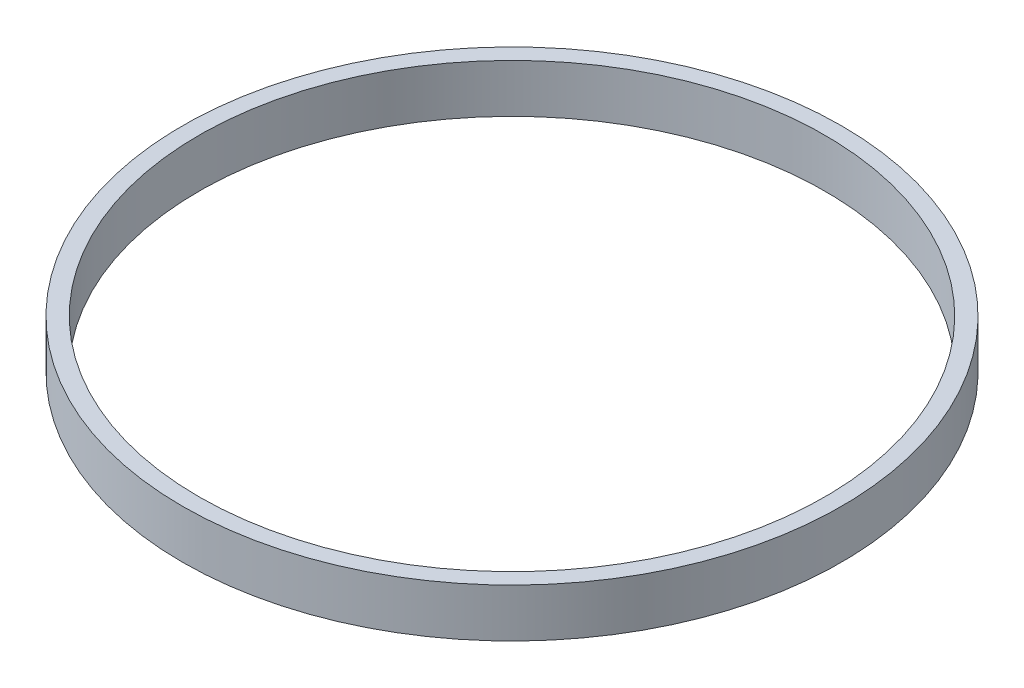
ISO-10303-21;
HEADER;
FILE_DESCRIPTION(('STEP AP214'),'2;1');
FILE_NAME('part.step','',(''),(''),'','','');
FILE_SCHEMA(('AUTOMOTIVE_DESIGN { 1 0 10303 214 1 1 1 1 }'));
ENDSEC;
DATA;
#1=APPLICATION_CONTEXT('core data for automotive mechanical design processes');
#2=APPLICATION_PROTOCOL_DEFINITION('international standard','automotive_design',2000,#1);
#3=PRODUCT_CONTEXT('',#1,'mechanical');
#4=PRODUCT('Part','Part','',(#3));
#5=PRODUCT_RELATED_PRODUCT_CATEGORY('part','',(#4));
#6=PRODUCT_DEFINITION_FORMATION('','',#4);
#7=PRODUCT_DEFINITION_CONTEXT('part definition',#1,'design');
#8=PRODUCT_DEFINITION('design','',#6,#7);
#9=PRODUCT_DEFINITION_SHAPE('','',#8);
#10=(LENGTH_UNIT() NAMED_UNIT(*) SI_UNIT(.MILLI.,.METRE.));
#11=(NAMED_UNIT(*) PLANE_ANGLE_UNIT() SI_UNIT($,.RADIAN.));
#12=(NAMED_UNIT(*) SI_UNIT($,.STERADIAN.) SOLID_ANGLE_UNIT());
#13=UNCERTAINTY_MEASURE_WITH_UNIT(LENGTH_MEASURE(1.E-05),#10,'distance_accuracy_value','');
#14=(GEOMETRIC_REPRESENTATION_CONTEXT(3) GLOBAL_UNCERTAINTY_ASSIGNED_CONTEXT((#13)) GLOBAL_UNIT_ASSIGNED_CONTEXT((#10,
#11,#12)) REPRESENTATION_CONTEXT('',''));
#15=CARTESIAN_POINT('',(0.,0.,0.));
#16=DIRECTION('',(0.,0.,1.));
#17=DIRECTION('',(1.,0.,0.));
#18=AXIS2_PLACEMENT_3D('',#15,#16,#17);
#19=CARTESIAN_POINT('',(0.,2.5,0.));
#20=DIRECTION('',(0.,-1.,0.));
#21=DIRECTION('',(0.,0.,-1.));
#22=AXIS2_PLACEMENT_3D('',#19,#20,#21);
#23=CYLINDRICAL_SURFACE('',#22,16.15);
#24=CARTESIAN_POINT('',(0.,2.5,0.));
#25=DIRECTION('',(0.,1.,0.));
#26=DIRECTION('',(0.,0.,1.));
#27=AXIS2_PLACEMENT_3D('',#24,#25,#26);
#28=CIRCLE('',#27,16.15);
#29=CARTESIAN_POINT('',(0.,2.5,16.15));
#30=VERTEX_POINT('',#29);
#31=EDGE_CURVE('E48',#30,#30,#28,.T.);
#32=ORIENTED_EDGE('',*,*,#31,.T.);
#33=EDGE_LOOP('',(#32));
#34=FACE_BOUND('',#33,.T.);
#35=CARTESIAN_POINT('',(0.,0.,0.));
#36=DIRECTION('',(0.,1.,0.));
#37=DIRECTION('',(0.,0.,1.));
#38=AXIS2_PLACEMENT_3D('',#35,#36,#37);
#39=CIRCLE('',#38,16.15);
#40=CARTESIAN_POINT('',(0.,0.,16.15));
#41=VERTEX_POINT('',#40);
#42=EDGE_CURVE('E54',#41,#41,#39,.T.);
#43=ORIENTED_EDGE('',*,*,#42,.F.);
#44=EDGE_LOOP('',(#43));
#45=FACE_BOUND('',#44,.T.);
#46=ADVANCED_FACE('F41',(#34,#45),#23,.F.);
#47=CARTESIAN_POINT('',(0.,2.5,0.));
#48=DIRECTION('',(0.,-1.,0.));
#49=DIRECTION('',(0.,0.,-1.));
#50=AXIS2_PLACEMENT_3D('',#47,#48,#49);
#51=CYLINDRICAL_SURFACE('',#50,17.);
#52=CARTESIAN_POINT('',(0.,2.5,0.));
#53=DIRECTION('',(0.,1.,0.));
#54=DIRECTION('',(0.,0.,1.));
#55=AXIS2_PLACEMENT_3D('',#52,#53,#54);
#56=CIRCLE('',#55,17.);
#57=CARTESIAN_POINT('',(0.,2.5,17.));
#58=VERTEX_POINT('',#57);
#59=EDGE_CURVE('E10',#58,#58,#56,.T.);
#60=ORIENTED_EDGE('',*,*,#59,.F.);
#61=EDGE_LOOP('',(#60));
#62=FACE_BOUND('',#61,.T.);
#63=CARTESIAN_POINT('',(0.,0.,0.));
#64=DIRECTION('',(0.,1.,0.));
#65=DIRECTION('',(0.,0.,1.));
#66=AXIS2_PLACEMENT_3D('',#63,#64,#65);
#67=CIRCLE('',#66,17.);
#68=CARTESIAN_POINT('',(0.,0.,17.));
#69=VERTEX_POINT('',#68);
#70=EDGE_CURVE('E44',#69,#69,#67,.T.);
#71=ORIENTED_EDGE('',*,*,#70,.T.);
#72=EDGE_LOOP('',(#71));
#73=FACE_BOUND('',#72,.T.);
#74=ADVANCED_FACE('F61',(#62,#73),#51,.T.);
#75=CARTESIAN_POINT('',(0.,2.5,0.));
#76=DIRECTION('',(0.,1.,0.));
#77=DIRECTION('',(0.,0.,1.));
#78=AXIS2_PLACEMENT_3D('',#75,#76,#77);
#79=PLANE('',#78);
#80=ORIENTED_EDGE('',*,*,#31,.F.);
#81=EDGE_LOOP('',(#80));
#82=FACE_BOUND('',#81,.T.);
#83=ORIENTED_EDGE('',*,*,#59,.T.);
#84=EDGE_LOOP('',(#83));
#85=FACE_BOUND('',#84,.T.);
#86=ADVANCED_FACE('F65',(#82,#85),#79,.T.);
#87=CARTESIAN_POINT('',(0.,0.,0.));
#88=DIRECTION('',(0.,1.,0.));
#89=DIRECTION('',(0.,0.,1.));
#90=AXIS2_PLACEMENT_3D('',#87,#88,#89);
#91=PLANE('',#90);
#92=ORIENTED_EDGE('',*,*,#42,.T.);
#93=EDGE_LOOP('',(#92));
#94=FACE_BOUND('',#93,.T.);
#95=ORIENTED_EDGE('',*,*,#70,.F.);
#96=EDGE_LOOP('',(#95));
#97=FACE_BOUND('',#96,.T.);
#98=ADVANCED_FACE('F63',(#94,#97),#91,.F.);
#99=CLOSED_SHELL('',(#46,#74,#86,#98));
#100=MANIFOLD_SOLID_BREP('B2',#99);
#101=ADVANCED_BREP_SHAPE_REPRESENTATION('',(#18,#100),#14);
#102=SHAPE_DEFINITION_REPRESENTATION(#9,#101);
ENDSEC;
END-ISO-10303-21;
